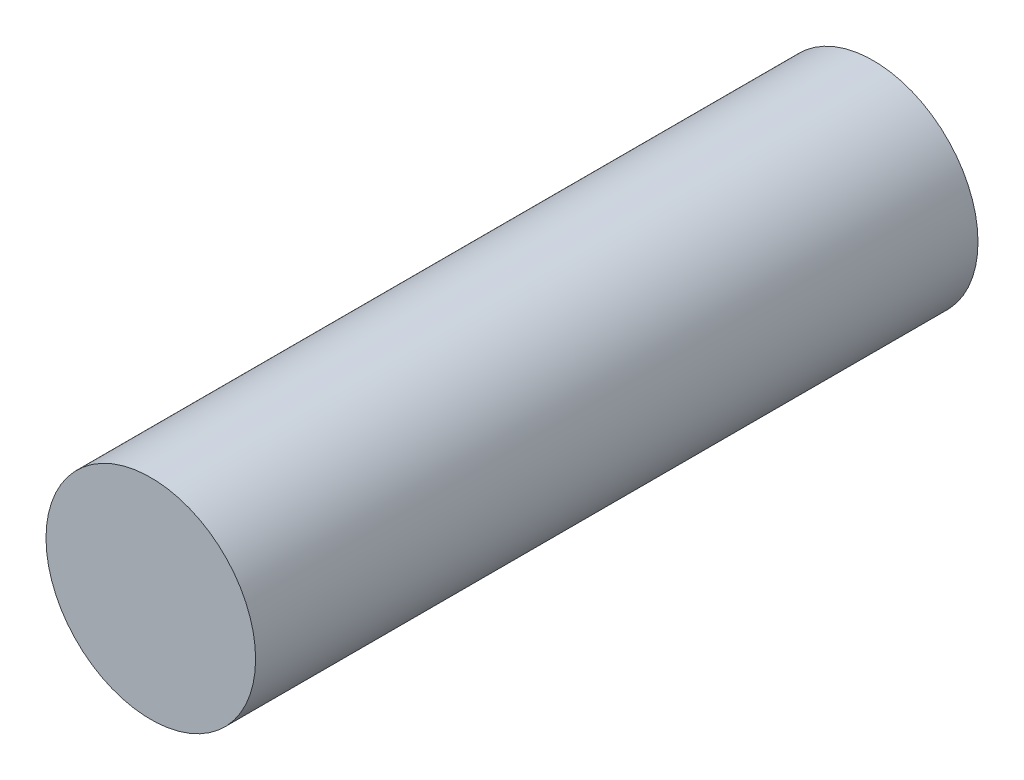
ISO-10303-21;
HEADER;
FILE_DESCRIPTION(('STEP AP214'),'2;1');
FILE_NAME('part.step','',(''),(''),'','','');
FILE_SCHEMA(('AUTOMOTIVE_DESIGN { 1 0 10303 214 1 1 1 1 }'));
ENDSEC;
DATA;
#1=APPLICATION_CONTEXT('core data for automotive mechanical design processes');
#2=APPLICATION_PROTOCOL_DEFINITION('international standard','automotive_design',2000,#1);
#3=PRODUCT_CONTEXT('',#1,'mechanical');
#4=PRODUCT('Part','Part','',(#3));
#5=PRODUCT_RELATED_PRODUCT_CATEGORY('part','',(#4));
#6=PRODUCT_DEFINITION_FORMATION('','',#4);
#7=PRODUCT_DEFINITION_CONTEXT('part definition',#1,'design');
#8=PRODUCT_DEFINITION('design','',#6,#7);
#9=PRODUCT_DEFINITION_SHAPE('','',#8);
#10=(LENGTH_UNIT() NAMED_UNIT(*) SI_UNIT(.MILLI.,.METRE.));
#11=(NAMED_UNIT(*) PLANE_ANGLE_UNIT() SI_UNIT($,.RADIAN.));
#12=(NAMED_UNIT(*) SI_UNIT($,.STERADIAN.) SOLID_ANGLE_UNIT());
#13=UNCERTAINTY_MEASURE_WITH_UNIT(LENGTH_MEASURE(1.E-05),#10,'distance_accuracy_value','');
#14=(GEOMETRIC_REPRESENTATION_CONTEXT(3) GLOBAL_UNCERTAINTY_ASSIGNED_CONTEXT((#13)) GLOBAL_UNIT_ASSIGNED_CONTEXT((#10,
#11,#12)) REPRESENTATION_CONTEXT('',''));
#15=CARTESIAN_POINT('',(0.,0.,0.));
#16=DIRECTION('',(0.,0.,1.));
#17=DIRECTION('',(1.,0.,0.));
#18=AXIS2_PLACEMENT_3D('',#15,#16,#17);
#19=CARTESIAN_POINT('',(38.481,-19.05,26.2636));
#20=DIRECTION('',(0.,0.,-1.));
#21=DIRECTION('',(-1.,0.,0.));
#22=AXIS2_PLACEMENT_3D('',#19,#20,#21);
#23=CYLINDRICAL_SURFACE('',#22,7.62);
#24=CARTESIAN_POINT('',(38.481,-19.05,26.2636));
#25=DIRECTION('',(0.,0.,1.));
#26=DIRECTION('',(1.,0.,0.));
#27=AXIS2_PLACEMENT_3D('',#24,#25,#26);
#28=CIRCLE('',#27,7.62);
#29=CARTESIAN_POINT('',(46.101,-19.05,26.2636));
#30=VERTEX_POINT('',#29);
#31=EDGE_CURVE('E10',#30,#30,#28,.T.);
#32=ORIENTED_EDGE('',*,*,#31,.F.);
#33=EDGE_LOOP('',(#32));
#34=FACE_BOUND('',#33,.T.);
#35=CARTESIAN_POINT('',(38.481,-19.05,-26.2636));
#36=DIRECTION('',(0.,0.,1.));
#37=DIRECTION('',(1.,0.,0.));
#38=AXIS2_PLACEMENT_3D('',#35,#36,#37);
#39=CIRCLE('',#38,7.62);
#40=CARTESIAN_POINT('',(46.101,-19.05,-26.2636));
#41=VERTEX_POINT('',#40);
#42=EDGE_CURVE('E44',#41,#41,#39,.T.);
#43=ORIENTED_EDGE('',*,*,#42,.T.);
#44=EDGE_LOOP('',(#43));
#45=FACE_BOUND('',#44,.T.);
#46=ADVANCED_FACE('F41',(#34,#45),#23,.T.);
#47=CARTESIAN_POINT('',(38.481,-19.05,26.2636));
#48=DIRECTION('',(0.,0.,1.));
#49=DIRECTION('',(1.,0.,0.));
#50=AXIS2_PLACEMENT_3D('',#47,#48,#49);
#51=PLANE('',#50);
#52=ORIENTED_EDGE('',*,*,#31,.T.);
#53=EDGE_LOOP('',(#52));
#54=FACE_BOUND('',#53,.T.);
#55=ADVANCED_FACE('F56',(#54),#51,.T.);
#56=CARTESIAN_POINT('',(38.481,-19.05,-26.2636));
#57=DIRECTION('',(0.,0.,1.));
#58=DIRECTION('',(1.,0.,0.));
#59=AXIS2_PLACEMENT_3D('',#56,#57,#58);
#60=PLANE('',#59);
#61=ORIENTED_EDGE('',*,*,#42,.F.);
#62=EDGE_LOOP('',(#61));
#63=FACE_BOUND('',#62,.T.);
#64=ADVANCED_FACE('F54',(#63),#60,.F.);
#65=CLOSED_SHELL('',(#46,#55,#64));
#66=MANIFOLD_SOLID_BREP('B2',#65);
#67=ADVANCED_BREP_SHAPE_REPRESENTATION('',(#18,#66),#14);
#68=SHAPE_DEFINITION_REPRESENTATION(#9,#67);
ENDSEC;
END-ISO-10303-21;
